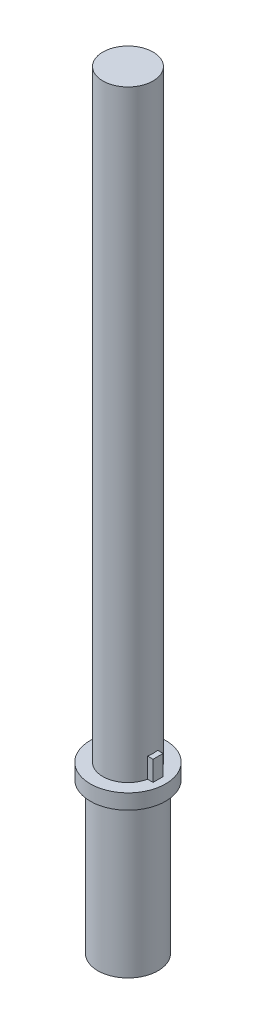
ISO-10303-21;
HEADER;
FILE_DESCRIPTION(('STEP AP214'),'2;1');
FILE_NAME('part.step','',(''),(''),'','','');
FILE_SCHEMA(('AUTOMOTIVE_DESIGN { 1 0 10303 214 1 1 1 1 }'));
ENDSEC;
DATA;
#1=APPLICATION_CONTEXT('core data for automotive mechanical design processes');
#2=APPLICATION_PROTOCOL_DEFINITION('international standard','automotive_design',2000,#1);
#3=PRODUCT_CONTEXT('',#1,'mechanical');
#4=PRODUCT('Part','Part','',(#3));
#5=PRODUCT_RELATED_PRODUCT_CATEGORY('part','',(#4));
#6=PRODUCT_DEFINITION_FORMATION('','',#4);
#7=PRODUCT_DEFINITION_CONTEXT('part definition',#1,'design');
#8=PRODUCT_DEFINITION('design','',#6,#7);
#9=PRODUCT_DEFINITION_SHAPE('','',#8);
#10=(LENGTH_UNIT() NAMED_UNIT(*) SI_UNIT(.MILLI.,.METRE.));
#11=(NAMED_UNIT(*) PLANE_ANGLE_UNIT() SI_UNIT($,.RADIAN.));
#12=(NAMED_UNIT(*) SI_UNIT($,.STERADIAN.) SOLID_ANGLE_UNIT());
#13=UNCERTAINTY_MEASURE_WITH_UNIT(LENGTH_MEASURE(1.E-05),#10,'distance_accuracy_value','');
#14=(GEOMETRIC_REPRESENTATION_CONTEXT(3) GLOBAL_UNCERTAINTY_ASSIGNED_CONTEXT((#13)) GLOBAL_UNIT_ASSIGNED_CONTEXT((#10,
#11,#12)) REPRESENTATION_CONTEXT('',''));
#15=CARTESIAN_POINT('',(0.,0.,0.));
#16=DIRECTION('',(0.,0.,1.));
#17=DIRECTION('',(1.,0.,0.));
#18=AXIS2_PLACEMENT_3D('',#15,#16,#17);
#19=CARTESIAN_POINT('',(0.,33.,0.));
#20=DIRECTION('',(0.,1.,0.));
#21=DIRECTION('',(0.,0.,1.));
#22=AXIS2_PLACEMENT_3D('',#19,#20,#21);
#23=PLANE('',#22);
#24=CARTESIAN_POINT('',(0.,33.,0.));
#25=DIRECTION('',(0.,1.,0.));
#26=DIRECTION('',(0.,0.,1.));
#27=AXIS2_PLACEMENT_3D('',#24,#25,#26);
#28=CIRCLE('',#27,7.5);
#29=CARTESIAN_POINT('',(0.,33.,7.5));
#30=VERTEX_POINT('',#29);
#31=EDGE_CURVE('E129',#30,#30,#28,.T.);
#32=ORIENTED_EDGE('',*,*,#31,.T.);
#33=EDGE_LOOP('',(#32));
#34=FACE_BOUND('',#33,.T.);
#35=DIRECTION('',(0.,0.,-1.));
#36=VECTOR('',#35,1.);
#37=CARTESIAN_POINT('',(6.,33.,0.));
#38=LINE('',#37,#36);
#39=CARTESIAN_POINT('',(6.,33.,1.));
#40=VERTEX_POINT('',#39);
#41=CARTESIAN_POINT('',(6.,33.,-1.));
#42=VERTEX_POINT('',#41);
#43=EDGE_CURVE('E259',#40,#42,#38,.T.);
#44=ORIENTED_EDGE('',*,*,#43,.F.);
#45=DIRECTION('',(1.,0.,0.));
#46=VECTOR('',#45,1.);
#47=CARTESIAN_POINT('',(0.,33.,1.));
#48=LINE('',#47,#46);
#49=CARTESIAN_POINT('',(4.89897948556636,33.,1.));
#50=VERTEX_POINT('',#49);
#51=EDGE_CURVE('E261',#50,#40,#48,.T.);
#52=ORIENTED_EDGE('',*,*,#51,.F.);
#53=CARTESIAN_POINT('',(0.,33.,0.));
#54=DIRECTION('',(0.,1.,0.));
#55=DIRECTION('',(0.,0.,1.));
#56=AXIS2_PLACEMENT_3D('',#53,#54,#55);
#57=CIRCLE('',#56,5.);
#58=CARTESIAN_POINT('',(4.89897948556636,33.,-1.));
#59=VERTEX_POINT('',#58);
#60=EDGE_CURVE('E12',#59,#50,#57,.T.);
#61=ORIENTED_EDGE('',*,*,#60,.F.);
#62=DIRECTION('',(1.,0.,0.));
#63=VECTOR('',#62,1.);
#64=CARTESIAN_POINT('',(0.,33.,-1.));
#65=LINE('',#64,#63);
#66=EDGE_CURVE('E95',#59,#42,#65,.T.);
#67=ORIENTED_EDGE('',*,*,#66,.T.);
#68=EDGE_LOOP('',(#44,#52,#61,#67));
#69=FACE_BOUND('',#68,.T.);
#70=ADVANCED_FACE('F53',(#34,#69),#23,.T.);
#71=CARTESIAN_POINT('',(0.,153.,0.));
#72=DIRECTION('',(0.,-1.,0.));
#73=DIRECTION('',(0.,0.,-1.));
#74=AXIS2_PLACEMENT_3D('',#71,#72,#73);
#75=CYLINDRICAL_SURFACE('',#74,5.);
#76=CARTESIAN_POINT('',(0.,153.,0.));
#77=DIRECTION('',(0.,1.,0.));
#78=DIRECTION('',(0.,0.,1.));
#79=AXIS2_PLACEMENT_3D('',#76,#77,#78);
#80=CIRCLE('',#79,5.);
#81=CARTESIAN_POINT('',(0.,153.,5.));
#82=VERTEX_POINT('',#81);
#83=EDGE_CURVE('E118',#82,#82,#80,.T.);
#84=ORIENTED_EDGE('',*,*,#83,.F.);
#85=EDGE_LOOP('',(#84));
#86=FACE_BOUND('',#85,.T.);
#87=DIRECTION('',(0.,-1.,0.));
#88=VECTOR('',#87,1.);
#89=CARTESIAN_POINT('',(4.89897948556636,37.,1.));
#90=LINE('',#89,#88);
#91=CARTESIAN_POINT('',(4.89897948556636,37.,1.));
#92=VERTEX_POINT('',#91);
#93=EDGE_CURVE('E103',#92,#50,#90,.T.);
#94=ORIENTED_EDGE('',*,*,#93,.F.);
#95=CARTESIAN_POINT('',(0.,37.,0.));
#96=DIRECTION('',(0.,1.,0.));
#97=DIRECTION('',(0.,0.,1.));
#98=AXIS2_PLACEMENT_3D('',#95,#96,#97);
#99=CIRCLE('',#98,5.);
#100=CARTESIAN_POINT('',(4.89897948556636,37.,-1.));
#101=VERTEX_POINT('',#100);
#102=EDGE_CURVE('E108',#101,#92,#99,.F.);
#103=ORIENTED_EDGE('',*,*,#102,.F.);
#104=DIRECTION('',(0.,-1.,0.));
#105=VECTOR('',#104,1.);
#106=CARTESIAN_POINT('',(4.89897948556636,37.,-1.));
#107=LINE('',#106,#105);
#108=EDGE_CURVE('E267',#101,#59,#107,.T.);
#109=ORIENTED_EDGE('',*,*,#108,.T.);
#110=ORIENTED_EDGE('',*,*,#60,.T.);
#111=EDGE_LOOP('',(#94,#103,#109,#110));
#112=FACE_BOUND('',#111,.T.);
#113=ADVANCED_FACE('F115',(#86,#112),#75,.T.);
#114=CARTESIAN_POINT('',(0.,0.,0.));
#115=DIRECTION('',(0.,1.,0.));
#116=DIRECTION('',(0.,0.,1.));
#117=AXIS2_PLACEMENT_3D('',#114,#115,#116);
#118=PLANE('',#117);
#119=CARTESIAN_POINT('',(0.,0.,0.));
#120=DIRECTION('',(0.,1.,0.));
#121=DIRECTION('',(0.,0.,1.));
#122=AXIS2_PLACEMENT_3D('',#119,#120,#121);
#123=CIRCLE('',#122,6.);
#124=CARTESIAN_POINT('',(0.,0.,6.));
#125=VERTEX_POINT('',#124);
#126=EDGE_CURVE('E57',#125,#125,#123,.T.);
#127=ORIENTED_EDGE('',*,*,#126,.F.);
#128=EDGE_LOOP('',(#127));
#129=FACE_BOUND('',#128,.T.);
#130=CARTESIAN_POINT('',(0.,0.,0.));
#131=DIRECTION('',(0.,1.,0.));
#132=DIRECTION('',(0.,0.,1.));
#133=AXIS2_PLACEMENT_3D('',#130,#131,#132);
#134=CIRCLE('',#133,5.25);
#135=CARTESIAN_POINT('',(0.,0.,5.25));
#136=VERTEX_POINT('',#135);
#137=EDGE_CURVE('E140',#136,#136,#134,.T.);
#138=ORIENTED_EDGE('',*,*,#137,.T.);
#139=EDGE_LOOP('',(#138));
#140=FACE_BOUND('',#139,.T.);
#141=ADVANCED_FACE('F152',(#129,#140),#118,.F.);
#142=CARTESIAN_POINT('',(0.,30.,0.));
#143=DIRECTION('',(0.,-1.,0.));
#144=DIRECTION('',(0.,0.,-1.));
#145=AXIS2_PLACEMENT_3D('',#142,#143,#144);
#146=CYLINDRICAL_SURFACE('',#145,6.);
#147=CARTESIAN_POINT('',(0.,30.,0.));
#148=DIRECTION('',(0.,1.,0.));
#149=DIRECTION('',(0.,0.,1.));
#150=AXIS2_PLACEMENT_3D('',#147,#148,#149);
#151=CIRCLE('',#150,6.);
#152=CARTESIAN_POINT('',(0.,30.,6.));
#153=VERTEX_POINT('',#152);
#154=EDGE_CURVE('E63',#153,#153,#151,.T.);
#155=ORIENTED_EDGE('',*,*,#154,.F.);
#156=EDGE_LOOP('',(#155));
#157=FACE_BOUND('',#156,.T.);
#158=ORIENTED_EDGE('',*,*,#126,.T.);
#159=EDGE_LOOP('',(#158));
#160=FACE_BOUND('',#159,.T.);
#161=ADVANCED_FACE('F55',(#157,#160),#146,.T.);
#162=CARTESIAN_POINT('',(0.,30.,0.));
#163=DIRECTION('',(0.,-1.,0.));
#164=DIRECTION('',(0.,0.,-1.));
#165=AXIS2_PLACEMENT_3D('',#162,#163,#164);
#166=CYLINDRICAL_SURFACE('',#165,5.25);
#167=CARTESIAN_POINT('',(0.,30.,0.));
#168=DIRECTION('',(0.,1.,0.));
#169=DIRECTION('',(0.,0.,1.));
#170=AXIS2_PLACEMENT_3D('',#167,#168,#169);
#171=CIRCLE('',#170,5.25);
#172=CARTESIAN_POINT('',(0.,30.,5.25));
#173=VERTEX_POINT('',#172);
#174=EDGE_CURVE('E133',#173,#173,#171,.T.);
#175=ORIENTED_EDGE('',*,*,#174,.T.);
#176=EDGE_LOOP('',(#175));
#177=FACE_BOUND('',#176,.T.);
#178=ORIENTED_EDGE('',*,*,#137,.F.);
#179=EDGE_LOOP('',(#178));
#180=FACE_BOUND('',#179,.T.);
#181=ADVANCED_FACE('F157',(#177,#180),#166,.F.);
#182=CARTESIAN_POINT('',(0.,30.,0.));
#183=DIRECTION('',(0.,1.,0.));
#184=DIRECTION('',(0.,0.,1.));
#185=AXIS2_PLACEMENT_3D('',#182,#183,#184);
#186=PLANE('',#185);
#187=ORIENTED_EDGE('',*,*,#174,.F.);
#188=EDGE_LOOP('',(#187));
#189=FACE_BOUND('',#188,.T.);
#190=ADVANCED_FACE('F159',(#189),#186,.F.);
#191=CARTESIAN_POINT('',(0.,33.,0.));
#192=DIRECTION('',(0.,-1.,0.));
#193=DIRECTION('',(0.,0.,-1.));
#194=AXIS2_PLACEMENT_3D('',#191,#192,#193);
#195=CYLINDRICAL_SURFACE('',#194,7.5);
#196=ORIENTED_EDGE('',*,*,#31,.F.);
#197=EDGE_LOOP('',(#196));
#198=FACE_BOUND('',#197,.T.);
#199=CARTESIAN_POINT('',(0.,30.,0.));
#200=DIRECTION('',(0.,1.,0.));
#201=DIRECTION('',(0.,0.,1.));
#202=AXIS2_PLACEMENT_3D('',#199,#200,#201);
#203=CIRCLE('',#202,7.5);
#204=CARTESIAN_POINT('',(0.,30.,7.5));
#205=VERTEX_POINT('',#204);
#206=EDGE_CURVE('E123',#205,#205,#203,.T.);
#207=ORIENTED_EDGE('',*,*,#206,.T.);
#208=EDGE_LOOP('',(#207));
#209=FACE_BOUND('',#208,.T.);
#210=ADVANCED_FACE('F166',(#198,#209),#195,.T.);
#211=ORIENTED_EDGE('',*,*,#154,.T.);
#212=EDGE_LOOP('',(#211));
#213=FACE_BOUND('',#212,.T.);
#214=ORIENTED_EDGE('',*,*,#206,.F.);
#215=EDGE_LOOP('',(#214));
#216=FACE_BOUND('',#215,.T.);
#217=ADVANCED_FACE('F169',(#213,#216),#186,.F.);
#218=CARTESIAN_POINT('',(0.,153.,0.));
#219=DIRECTION('',(0.,1.,0.));
#220=DIRECTION('',(0.,0.,1.));
#221=AXIS2_PLACEMENT_3D('',#218,#219,#220);
#222=PLANE('',#221);
#223=ORIENTED_EDGE('',*,*,#83,.T.);
#224=EDGE_LOOP('',(#223));
#225=FACE_BOUND('',#224,.T.);
#226=ADVANCED_FACE('F184',(#225),#222,.T.);
#227=CARTESIAN_POINT('',(0.,37.,1.));
#228=DIRECTION('',(0.,0.,-1.));
#229=DIRECTION('',(-1.,0.,0.));
#230=AXIS2_PLACEMENT_3D('',#227,#228,#229);
#231=PLANE('',#230);
#232=ORIENTED_EDGE('',*,*,#51,.T.);
#233=DIRECTION('',(0.,-1.,0.));
#234=VECTOR('',#233,1.);
#235=CARTESIAN_POINT('',(6.,37.,1.));
#236=LINE('',#235,#234);
#237=CARTESIAN_POINT('',(6.,37.,1.));
#238=VERTEX_POINT('',#237);
#239=EDGE_CURVE('E106',#238,#40,#236,.T.);
#240=ORIENTED_EDGE('',*,*,#239,.F.);
#241=DIRECTION('',(1.,0.,0.));
#242=VECTOR('',#241,1.);
#243=CARTESIAN_POINT('',(0.,37.,1.));
#244=LINE('',#243,#242);
#245=EDGE_CURVE('E100',#92,#238,#244,.T.);
#246=ORIENTED_EDGE('',*,*,#245,.F.);
#247=ORIENTED_EDGE('',*,*,#93,.T.);
#248=EDGE_LOOP('',(#232,#240,#246,#247));
#249=FACE_BOUND('',#248,.T.);
#250=ADVANCED_FACE('F101',(#249),#231,.F.);
#251=CARTESIAN_POINT('',(6.,37.,0.));
#252=DIRECTION('',(-1.,0.,0.));
#253=DIRECTION('',(0.,0.,1.));
#254=AXIS2_PLACEMENT_3D('',#251,#252,#253);
#255=PLANE('',#254);
#256=ORIENTED_EDGE('',*,*,#43,.T.);
#257=DIRECTION('',(0.,-1.,0.));
#258=VECTOR('',#257,1.);
#259=CARTESIAN_POINT('',(6.,37.,-1.));
#260=LINE('',#259,#258);
#261=CARTESIAN_POINT('',(6.,37.,-1.));
#262=VERTEX_POINT('',#261);
#263=EDGE_CURVE('E125',#262,#42,#260,.T.);
#264=ORIENTED_EDGE('',*,*,#263,.F.);
#265=DIRECTION('',(0.,0.,-1.));
#266=VECTOR('',#265,1.);
#267=CARTESIAN_POINT('',(6.,37.,0.));
#268=LINE('',#267,#266);
#269=EDGE_CURVE('E77',#238,#262,#268,.T.);
#270=ORIENTED_EDGE('',*,*,#269,.F.);
#271=ORIENTED_EDGE('',*,*,#239,.T.);
#272=EDGE_LOOP('',(#256,#264,#270,#271));
#273=FACE_BOUND('',#272,.T.);
#274=ADVANCED_FACE('F225',(#273),#255,.F.);
#275=CARTESIAN_POINT('',(0.,37.,-1.));
#276=DIRECTION('',(0.,0.,-1.));
#277=DIRECTION('',(-1.,0.,0.));
#278=AXIS2_PLACEMENT_3D('',#275,#276,#277);
#279=PLANE('',#278);
#280=ORIENTED_EDGE('',*,*,#66,.F.);
#281=ORIENTED_EDGE('',*,*,#108,.F.);
#282=DIRECTION('',(1.,0.,0.));
#283=VECTOR('',#282,1.);
#284=CARTESIAN_POINT('',(0.,37.,-1.));
#285=LINE('',#284,#283);
#286=EDGE_CURVE('E71',#101,#262,#285,.T.);
#287=ORIENTED_EDGE('',*,*,#286,.T.);
#288=ORIENTED_EDGE('',*,*,#263,.T.);
#289=EDGE_LOOP('',(#280,#281,#287,#288));
#290=FACE_BOUND('',#289,.T.);
#291=ADVANCED_FACE('F234',(#290),#279,.T.);
#292=CARTESIAN_POINT('',(0.,37.,0.));
#293=DIRECTION('',(0.,1.,0.));
#294=DIRECTION('',(0.,0.,1.));
#295=AXIS2_PLACEMENT_3D('',#292,#293,#294);
#296=PLANE('',#295);
#297=ORIENTED_EDGE('',*,*,#102,.T.);
#298=ORIENTED_EDGE('',*,*,#245,.T.);
#299=ORIENTED_EDGE('',*,*,#269,.T.);
#300=ORIENTED_EDGE('',*,*,#286,.F.);
#301=EDGE_LOOP('',(#297,#298,#299,#300));
#302=FACE_BOUND('',#301,.T.);
#303=ADVANCED_FACE('F111',(#302),#296,.T.);
#304=CLOSED_SHELL('',(#70,#113,#141,#161,#181,#190,#210,#217,#226,#250,#274,#291,#303));
#305=MANIFOLD_SOLID_BREP('B2',#304);
#306=ADVANCED_BREP_SHAPE_REPRESENTATION('',(#18,#305),#14);
#307=SHAPE_DEFINITION_REPRESENTATION(#9,#306);
ENDSEC;
END-ISO-10303-21;
